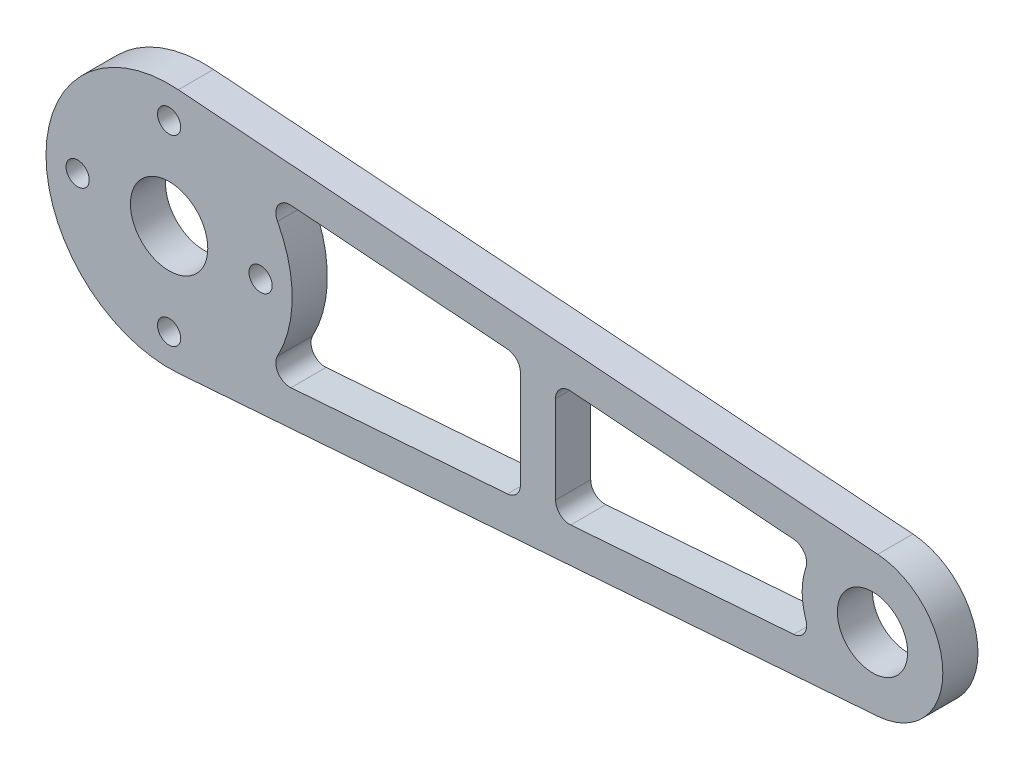
ISO-10303-21;
HEADER;
FILE_DESCRIPTION(('STEP AP214'),'2;1');
FILE_NAME('part.step','',(''),(''),'','','');
FILE_SCHEMA(('AUTOMOTIVE_DESIGN { 1 0 10303 214 1 1 1 1 }'));
ENDSEC;
DATA;
#1=APPLICATION_CONTEXT('core data for automotive mechanical design processes');
#2=APPLICATION_PROTOCOL_DEFINITION('international standard','automotive_design',2000,#1);
#3=PRODUCT_CONTEXT('',#1,'mechanical');
#4=PRODUCT('Part','Part','',(#3));
#5=PRODUCT_RELATED_PRODUCT_CATEGORY('part','',(#4));
#6=PRODUCT_DEFINITION_FORMATION('','',#4);
#7=PRODUCT_DEFINITION_CONTEXT('part definition',#1,'design');
#8=PRODUCT_DEFINITION('design','',#6,#7);
#9=PRODUCT_DEFINITION_SHAPE('','',#8);
#10=(LENGTH_UNIT() NAMED_UNIT(*) SI_UNIT(.MILLI.,.METRE.));
#11=(NAMED_UNIT(*) PLANE_ANGLE_UNIT() SI_UNIT($,.RADIAN.));
#12=(NAMED_UNIT(*) SI_UNIT($,.STERADIAN.) SOLID_ANGLE_UNIT());
#13=UNCERTAINTY_MEASURE_WITH_UNIT(LENGTH_MEASURE(1.E-05),#10,'distance_accuracy_value','');
#14=(GEOMETRIC_REPRESENTATION_CONTEXT(3) GLOBAL_UNCERTAINTY_ASSIGNED_CONTEXT((#13)) GLOBAL_UNIT_ASSIGNED_CONTEXT((#10,
#11,#12)) REPRESENTATION_CONTEXT('',''));
#15=CARTESIAN_POINT('',(0.,0.,0.));
#16=DIRECTION('',(0.,0.,1.));
#17=DIRECTION('',(1.,0.,0.));
#18=AXIS2_PLACEMENT_3D('',#15,#16,#17);
#19=CARTESIAN_POINT('',(0.,0.,5.));
#20=DIRECTION('',(0.,0.,1.));
#21=DIRECTION('',(1.,0.,0.));
#22=AXIS2_PLACEMENT_3D('',#19,#20,#21);
#23=PLANE('',#22);
#24=CARTESIAN_POINT('',(0.,-13.,5.));
#25=DIRECTION('',(0.,0.,1.));
#26=DIRECTION('',(1.,0.,0.));
#27=AXIS2_PLACEMENT_3D('',#24,#25,#26);
#28=CIRCLE('',#27,1.65);
#29=CARTESIAN_POINT('',(1.64999999999991,-13.,5.));
#30=VERTEX_POINT('',#29);
#31=EDGE_CURVE('E240',#30,#30,#28,.T.);
#32=ORIENTED_EDGE('',*,*,#31,.F.);
#33=EDGE_LOOP('',(#32));
#34=FACE_BOUND('',#33,.T.);
#35=CARTESIAN_POINT('',(0.,13.,5.));
#36=DIRECTION('',(0.,0.,1.));
#37=DIRECTION('',(1.,0.,0.));
#38=AXIS2_PLACEMENT_3D('',#35,#36,#37);
#39=CIRCLE('',#38,1.65);
#40=CARTESIAN_POINT('',(1.65,13.,5.));
#41=VERTEX_POINT('',#40);
#42=EDGE_CURVE('E252',#41,#41,#39,.T.);
#43=ORIENTED_EDGE('',*,*,#42,.F.);
#44=EDGE_LOOP('',(#43));
#45=FACE_BOUND('',#44,.T.);
#46=CARTESIAN_POINT('',(0.,0.,5.));
#47=DIRECTION('',(0.,0.,1.));
#48=DIRECTION('',(1.,0.,0.));
#49=AXIS2_PLACEMENT_3D('',#46,#47,#48);
#50=CIRCLE('',#49,5.5);
#51=CARTESIAN_POINT('',(5.5,0.,5.));
#52=VERTEX_POINT('',#51);
#53=EDGE_CURVE('E264',#52,#52,#50,.T.);
#54=ORIENTED_EDGE('',*,*,#53,.F.);
#55=EDGE_LOOP('',(#54));
#56=FACE_BOUND('',#55,.T.);
#57=CARTESIAN_POINT('',(0.,0.,5.));
#58=DIRECTION('',(0.,0.,1.));
#59=DIRECTION('',(1.,0.,0.));
#60=AXIS2_PLACEMENT_3D('',#57,#58,#59);
#61=CIRCLE('',#60,17.5);
#62=CARTESIAN_POINT('',(1.31249999999999,17.4507118407817,5.));
#63=VERTEX_POINT('',#62);
#64=CARTESIAN_POINT('',(1.31250000000001,-17.4507118407817,5.));
#65=VERTEX_POINT('',#64);
#66=EDGE_CURVE('E329',#63,#65,#61,.T.);
#67=ORIENTED_EDGE('',*,*,#66,.T.);
#68=DIRECTION('',(0.997183533758957,0.0750000000000005,0.));
#69=VECTOR('',#68,1.);
#70=CARTESIAN_POINT('',(1.31250000000001,-17.4507118407817,5.));
#71=LINE('',#70,#69);
#72=CARTESIAN_POINT('',(100.75,-9.97183533758952,5.));
#73=VERTEX_POINT('',#72);
#74=EDGE_CURVE('E332',#65,#73,#71,.T.);
#75=ORIENTED_EDGE('',*,*,#74,.T.);
#76=CARTESIAN_POINT('',(100.,0.,5.));
#77=DIRECTION('',(0.,0.,1.));
#78=DIRECTION('',(1.,0.,0.));
#79=AXIS2_PLACEMENT_3D('',#76,#77,#78);
#80=CIRCLE('',#79,10.);
#81=CARTESIAN_POINT('',(100.75,9.97183533758961,5.));
#82=VERTEX_POINT('',#81);
#83=EDGE_CURVE('E335',#73,#82,#80,.T.);
#84=ORIENTED_EDGE('',*,*,#83,.T.);
#85=DIRECTION('',(-0.997183533758957,0.0749999999999997,0.));
#86=VECTOR('',#85,1.);
#87=CARTESIAN_POINT('',(1.31249999999999,17.4507118407817,5.));
#88=LINE('',#87,#86);
#89=EDGE_CURVE('E337',#82,#63,#88,.T.);
#90=ORIENTED_EDGE('',*,*,#89,.T.);
#91=EDGE_LOOP('',(#67,#75,#84,#90));
#92=FACE_BOUND('',#91,.T.);
#93=CARTESIAN_POINT('',(100.,0.,5.));
#94=DIRECTION('',(0.,0.,-1.));
#95=DIRECTION('',(1.,0.,0.));
#96=AXIS2_PLACEMENT_3D('',#93,#94,#95);
#97=CIRCLE('',#96,9.99999999999999);
#98=CARTESIAN_POINT('',(90.5323119515982,-3.21914321181123,5.));
#99=VERTEX_POINT('',#98);
#100=CARTESIAN_POINT('',(90.5323119515982,3.21914321181132,5.));
#101=VERTEX_POINT('',#100);
#102=EDGE_CURVE('E272',#99,#101,#97,.T.);
#103=ORIENTED_EDGE('',*,*,#102,.F.);
#104=CARTESIAN_POINT('',(88.6387743419179,-3.86297185417349,5.));
#105=DIRECTION('',(0.,0.,1.));
#106=DIRECTION('',(-1.,0.,0.));
#107=AXIS2_PLACEMENT_3D('',#104,#105,#106);
#108=CIRCLE('',#107,2.);
#109=CARTESIAN_POINT('',(88.7887743419179,-5.8573389216914,5.));
#110=VERTEX_POINT('',#109);
#111=EDGE_CURVE('E270',#110,#99,#108,.T.);
#112=ORIENTED_EDGE('',*,*,#111,.F.);
#113=DIRECTION('',(0.997183533758956,0.0750000000000008,0.));
#114=VECTOR('',#113,1.);
#115=CARTESIAN_POINT('',(57.0947957316832,-8.24110110316984,5.));
#116=LINE('',#115,#114);
#117=CARTESIAN_POINT('',(57.0947957316832,-8.24110110316984,5.));
#118=VERTEX_POINT('',#117);
#119=EDGE_CURVE('E286',#118,#110,#116,.T.);
#120=ORIENTED_EDGE('',*,*,#119,.F.);
#121=CARTESIAN_POINT('',(56.9447957316832,-6.24673403565193,5.));
#122=DIRECTION('',(0.,0.,1.));
#123=DIRECTION('',(-1.,0.,0.));
#124=AXIS2_PLACEMENT_3D('',#121,#122,#123);
#125=CIRCLE('',#124,2.);
#126=CARTESIAN_POINT('',(54.9447957316832,-6.24673403565192,5.));
#127=VERTEX_POINT('',#126);
#128=EDGE_CURVE('E283',#127,#118,#125,.T.);
#129=ORIENTED_EDGE('',*,*,#128,.F.);
#130=DIRECTION('',(0.,-1.,0.));
#131=VECTOR('',#130,1.);
#132=CARTESIAN_POINT('',(54.9447957316832,6.24673403565196,5.));
#133=LINE('',#132,#131);
#134=CARTESIAN_POINT('',(54.9447957316832,6.24673403565196,5.));
#135=VERTEX_POINT('',#134);
#136=EDGE_CURVE('E281',#135,#127,#133,.T.);
#137=ORIENTED_EDGE('',*,*,#136,.F.);
#138=CARTESIAN_POINT('',(56.9447957316832,6.24673403565198,5.));
#139=DIRECTION('',(0.,0.,1.));
#140=DIRECTION('',(-1.,0.,0.));
#141=AXIS2_PLACEMENT_3D('',#138,#139,#140);
#142=CIRCLE('',#141,2.);
#143=CARTESIAN_POINT('',(57.0947957316832,8.24110110316989,5.));
#144=VERTEX_POINT('',#143);
#145=EDGE_CURVE('E279',#144,#135,#142,.T.);
#146=ORIENTED_EDGE('',*,*,#145,.F.);
#147=DIRECTION('',(-0.997183533758956,0.0749999999999995,0.));
#148=VECTOR('',#147,1.);
#149=CARTESIAN_POINT('',(57.0947957316832,8.24110110316989,5.));
#150=LINE('',#149,#148);
#151=CARTESIAN_POINT('',(88.7887743419179,5.85733892169149,5.));
#152=VERTEX_POINT('',#151);
#153=EDGE_CURVE('E277',#152,#144,#150,.T.);
#154=ORIENTED_EDGE('',*,*,#153,.F.);
#155=CARTESIAN_POINT('',(88.6387743419179,3.86297185417358,5.));
#156=DIRECTION('',(0.,0.,1.));
#157=DIRECTION('',(1.,0.,0.));
#158=AXIS2_PLACEMENT_3D('',#155,#156,#157);
#159=CIRCLE('',#158,2.);
#160=EDGE_CURVE('E275',#101,#152,#159,.T.);
#161=ORIENTED_EDGE('',*,*,#160,.F.);
#162=EDGE_LOOP('',(#103,#112,#120,#129,#137,#146,#154,#161));
#163=FACE_BOUND('',#162,.T.);
#164=CARTESIAN_POINT('',(100.,0.,5.));
#165=DIRECTION('',(0.,0.,1.));
#166=DIRECTION('',(1.,0.,0.));
#167=AXIS2_PLACEMENT_3D('',#164,#165,#166);
#168=CIRCLE('',#167,5.);
#169=CARTESIAN_POINT('',(105.,0.,5.));
#170=VERTEX_POINT('',#169);
#171=EDGE_CURVE('E258',#170,#170,#168,.T.);
#172=ORIENTED_EDGE('',*,*,#171,.F.);
#173=EDGE_LOOP('',(#172));
#174=FACE_BOUND('',#173,.T.);
#175=CARTESIAN_POINT('',(13.,0.,5.));
#176=DIRECTION('',(0.,0.,1.));
#177=DIRECTION('',(1.,0.,0.));
#178=AXIS2_PLACEMENT_3D('',#175,#176,#177);
#179=CIRCLE('',#178,1.65);
#180=CARTESIAN_POINT('',(14.65,0.,5.));
#181=VERTEX_POINT('',#180);
#182=EDGE_CURVE('E246',#181,#181,#179,.T.);
#183=ORIENTED_EDGE('',*,*,#182,.F.);
#184=EDGE_LOOP('',(#183));
#185=FACE_BOUND('',#184,.T.);
#186=CARTESIAN_POINT('',(-13.,1.36167772214882E-13,5.));
#187=DIRECTION('',(0.,0.,1.));
#188=DIRECTION('',(1.,0.,0.));
#189=AXIS2_PLACEMENT_3D('',#186,#187,#188);
#190=CIRCLE('',#189,1.65);
#191=CARTESIAN_POINT('',(-11.35,1.36167772214882E-13,5.));
#192=VERTEX_POINT('',#191);
#193=EDGE_CURVE('E234',#192,#192,#190,.T.);
#194=ORIENTED_EDGE('',*,*,#193,.F.);
#195=EDGE_LOOP('',(#194));
#196=FACE_BOUND('',#195,.T.);
#197=DIRECTION('',(0.,1.,0.));
#198=VECTOR('',#197,1.);
#199=CARTESIAN_POINT('',(49.9447957316831,6.92364051991322,5.));
#200=LINE('',#199,#198);
#201=CARTESIAN_POINT('',(49.9447957316831,-6.92364051991319,5.));
#202=VERTEX_POINT('',#201);
#203=CARTESIAN_POINT('',(49.9447957316831,6.92364051991322,5.));
#204=VERTEX_POINT('',#203);
#205=EDGE_CURVE('E177',#202,#204,#200,.T.);
#206=ORIENTED_EDGE('',*,*,#205,.F.);
#207=CARTESIAN_POINT('',(47.9447957316831,-6.9236405199132,5.));
#208=DIRECTION('',(0.,0.,1.));
#209=DIRECTION('',(-1.,0.,0.));
#210=AXIS2_PLACEMENT_3D('',#207,#208,#209);
#211=CIRCLE('',#210,2.);
#212=CARTESIAN_POINT('',(48.0947957316831,-8.91800758743112,5.));
#213=VERTEX_POINT('',#212);
#214=EDGE_CURVE('E169',#213,#202,#211,.T.);
#215=ORIENTED_EDGE('',*,*,#214,.F.);
#216=DIRECTION('',(0.997183533758957,0.0750000000000004,0.));
#217=VECTOR('',#216,1.);
#218=CARTESIAN_POINT('',(17.3228974623749,-11.2324184176003,5.));
#219=LINE('',#218,#217);
#220=CARTESIAN_POINT('',(17.3228974623749,-11.2324184176003,5.));
#221=VERTEX_POINT('',#220);
#222=EDGE_CURVE('E202',#221,#213,#219,.T.);
#223=ORIENTED_EDGE('',*,*,#222,.F.);
#224=CARTESIAN_POINT('',(17.1728974623749,-9.23805135008241,5.));
#225=DIRECTION('',(0.,0.,1.));
#226=DIRECTION('',(1.,0.,0.));
#227=AXIS2_PLACEMENT_3D('',#224,#225,#226);
#228=CIRCLE('',#227,2.);
#229=CARTESIAN_POINT('',(15.411574645721,-8.29055890392011,5.));
#230=VERTEX_POINT('',#229);
#231=EDGE_CURVE('E200',#230,#221,#228,.T.);
#232=ORIENTED_EDGE('',*,*,#231,.F.);
#233=CARTESIAN_POINT('',(0.,0.,5.));
#234=DIRECTION('',(0.,0.,-1.));
#235=DIRECTION('',(1.,0.,0.));
#236=AXIS2_PLACEMENT_3D('',#233,#234,#235);
#237=CIRCLE('',#236,17.5);
#238=CARTESIAN_POINT('',(15.411574645721,8.29055890392012,5.));
#239=VERTEX_POINT('',#238);
#240=EDGE_CURVE('E198',#239,#230,#237,.T.);
#241=ORIENTED_EDGE('',*,*,#240,.F.);
#242=CARTESIAN_POINT('',(17.1728974623749,9.23805135008242,5.));
#243=DIRECTION('',(0.,0.,1.));
#244=DIRECTION('',(-1.,0.,0.));
#245=AXIS2_PLACEMENT_3D('',#242,#243,#244);
#246=CIRCLE('',#245,2.);
#247=CARTESIAN_POINT('',(17.3228974623749,11.2324184176003,5.));
#248=VERTEX_POINT('',#247);
#249=EDGE_CURVE('E196',#248,#239,#246,.T.);
#250=ORIENTED_EDGE('',*,*,#249,.F.);
#251=DIRECTION('',(-0.997183533758957,0.0749999999999994,0.));
#252=VECTOR('',#251,1.);
#253=CARTESIAN_POINT('',(17.3228974623749,11.2324184176003,5.));
#254=LINE('',#253,#252);
#255=CARTESIAN_POINT('',(48.0947957316831,8.91800758743115,5.));
#256=VERTEX_POINT('',#255);
#257=EDGE_CURVE('E192',#256,#248,#254,.T.);
#258=ORIENTED_EDGE('',*,*,#257,.F.);
#259=CARTESIAN_POINT('',(47.9447957316831,6.92364051991324,5.));
#260=DIRECTION('',(0.,0.,1.));
#261=DIRECTION('',(-1.,0.,0.));
#262=AXIS2_PLACEMENT_3D('',#259,#260,#261);
#263=CIRCLE('',#262,2.);
#264=EDGE_CURVE('E190',#204,#256,#263,.T.);
#265=ORIENTED_EDGE('',*,*,#264,.F.);
#266=EDGE_LOOP('',(#206,#215,#223,#232,#241,#250,#258,#265));
#267=FACE_BOUND('',#266,.T.);
#268=ADVANCED_FACE('F32',(#34,#45,#56,#92,#163,#174,#185,#196,#267),#23,.T.);
#269=CARTESIAN_POINT('',(0.,0.,0.));
#270=DIRECTION('',(0.,0.,1.));
#271=DIRECTION('',(1.,0.,0.));
#272=AXIS2_PLACEMENT_3D('',#269,#270,#271);
#273=PLANE('',#272);
#274=CARTESIAN_POINT('',(-13.,1.36167772214882E-13,0.));
#275=DIRECTION('',(0.,0.,1.));
#276=DIRECTION('',(1.,0.,0.));
#277=AXIS2_PLACEMENT_3D('',#274,#275,#276);
#278=CIRCLE('',#277,1.65);
#279=CARTESIAN_POINT('',(-11.35,1.36167772214882E-13,0.));
#280=VERTEX_POINT('',#279);
#281=EDGE_CURVE('E185',#280,#280,#278,.T.);
#282=ORIENTED_EDGE('',*,*,#281,.T.);
#283=EDGE_LOOP('',(#282));
#284=FACE_BOUND('',#283,.T.);
#285=CARTESIAN_POINT('',(0.,-13.,0.));
#286=DIRECTION('',(0.,0.,1.));
#287=DIRECTION('',(1.,0.,0.));
#288=AXIS2_PLACEMENT_3D('',#285,#286,#287);
#289=CIRCLE('',#288,1.65);
#290=CARTESIAN_POINT('',(1.64999999999991,-13.,0.));
#291=VERTEX_POINT('',#290);
#292=EDGE_CURVE('E237',#291,#291,#289,.T.);
#293=ORIENTED_EDGE('',*,*,#292,.T.);
#294=EDGE_LOOP('',(#293));
#295=FACE_BOUND('',#294,.T.);
#296=CARTESIAN_POINT('',(13.,0.,0.));
#297=DIRECTION('',(0.,0.,1.));
#298=DIRECTION('',(1.,0.,0.));
#299=AXIS2_PLACEMENT_3D('',#296,#297,#298);
#300=CIRCLE('',#299,1.65);
#301=CARTESIAN_POINT('',(14.65,0.,0.));
#302=VERTEX_POINT('',#301);
#303=EDGE_CURVE('E243',#302,#302,#300,.T.);
#304=ORIENTED_EDGE('',*,*,#303,.T.);
#305=EDGE_LOOP('',(#304));
#306=FACE_BOUND('',#305,.T.);
#307=CARTESIAN_POINT('',(0.,13.,0.));
#308=DIRECTION('',(0.,0.,1.));
#309=DIRECTION('',(1.,0.,0.));
#310=AXIS2_PLACEMENT_3D('',#307,#308,#309);
#311=CIRCLE('',#310,1.65);
#312=CARTESIAN_POINT('',(1.65,13.,0.));
#313=VERTEX_POINT('',#312);
#314=EDGE_CURVE('E249',#313,#313,#311,.T.);
#315=ORIENTED_EDGE('',*,*,#314,.T.);
#316=EDGE_LOOP('',(#315));
#317=FACE_BOUND('',#316,.T.);
#318=CARTESIAN_POINT('',(100.,0.,0.));
#319=DIRECTION('',(0.,0.,1.));
#320=DIRECTION('',(1.,0.,0.));
#321=AXIS2_PLACEMENT_3D('',#318,#319,#320);
#322=CIRCLE('',#321,5.);
#323=CARTESIAN_POINT('',(105.,0.,0.));
#324=VERTEX_POINT('',#323);
#325=EDGE_CURVE('E255',#324,#324,#322,.T.);
#326=ORIENTED_EDGE('',*,*,#325,.T.);
#327=EDGE_LOOP('',(#326));
#328=FACE_BOUND('',#327,.T.);
#329=CARTESIAN_POINT('',(0.,0.,0.));
#330=DIRECTION('',(0.,0.,1.));
#331=DIRECTION('',(1.,0.,0.));
#332=AXIS2_PLACEMENT_3D('',#329,#330,#331);
#333=CIRCLE('',#332,5.5);
#334=CARTESIAN_POINT('',(5.5,0.,0.));
#335=VERTEX_POINT('',#334);
#336=EDGE_CURVE('E261',#335,#335,#333,.T.);
#337=ORIENTED_EDGE('',*,*,#336,.T.);
#338=EDGE_LOOP('',(#337));
#339=FACE_BOUND('',#338,.T.);
#340=CARTESIAN_POINT('',(88.6387743419179,-3.86297185417349,0.));
#341=DIRECTION('',(0.,0.,1.));
#342=DIRECTION('',(-1.,0.,0.));
#343=AXIS2_PLACEMENT_3D('',#340,#341,#342);
#344=CIRCLE('',#343,2.);
#345=CARTESIAN_POINT('',(88.7887743419179,-5.8573389216914,0.));
#346=VERTEX_POINT('',#345);
#347=CARTESIAN_POINT('',(90.5323119515982,-3.21914321181123,0.));
#348=VERTEX_POINT('',#347);
#349=EDGE_CURVE('E267',#346,#348,#344,.T.);
#350=ORIENTED_EDGE('',*,*,#349,.T.);
#351=CARTESIAN_POINT('',(100.,0.,0.));
#352=DIRECTION('',(0.,0.,-1.));
#353=DIRECTION('',(1.,0.,0.));
#354=AXIS2_PLACEMENT_3D('',#351,#352,#353);
#355=CIRCLE('',#354,9.99999999999999);
#356=CARTESIAN_POINT('',(90.5323119515982,3.21914321181132,0.));
#357=VERTEX_POINT('',#356);
#358=EDGE_CURVE('E291',#348,#357,#355,.T.);
#359=ORIENTED_EDGE('',*,*,#358,.T.);
#360=CARTESIAN_POINT('',(88.6387743419179,3.86297185417358,0.));
#361=DIRECTION('',(0.,0.,1.));
#362=DIRECTION('',(1.,0.,0.));
#363=AXIS2_PLACEMENT_3D('',#360,#361,#362);
#364=CIRCLE('',#363,2.);
#365=CARTESIAN_POINT('',(88.7887743419179,5.85733892169149,0.));
#366=VERTEX_POINT('',#365);
#367=EDGE_CURVE('E294',#357,#366,#364,.T.);
#368=ORIENTED_EDGE('',*,*,#367,.T.);
#369=DIRECTION('',(-0.997183533758956,0.0749999999999995,0.));
#370=VECTOR('',#369,1.);
#371=CARTESIAN_POINT('',(57.0947957316832,8.24110110316989,0.));
#372=LINE('',#371,#370);
#373=CARTESIAN_POINT('',(57.0947957316832,8.24110110316989,0.));
#374=VERTEX_POINT('',#373);
#375=EDGE_CURVE('E297',#366,#374,#372,.T.);
#376=ORIENTED_EDGE('',*,*,#375,.T.);
#377=CARTESIAN_POINT('',(56.9447957316832,6.24673403565198,0.));
#378=DIRECTION('',(0.,0.,1.));
#379=DIRECTION('',(-1.,0.,0.));
#380=AXIS2_PLACEMENT_3D('',#377,#378,#379);
#381=CIRCLE('',#380,2.);
#382=CARTESIAN_POINT('',(54.9447957316832,6.24673403565196,0.));
#383=VERTEX_POINT('',#382);
#384=EDGE_CURVE('E300',#374,#383,#381,.T.);
#385=ORIENTED_EDGE('',*,*,#384,.T.);
#386=DIRECTION('',(0.,-1.,0.));
#387=VECTOR('',#386,1.);
#388=CARTESIAN_POINT('',(54.9447957316832,6.24673403565196,0.));
#389=LINE('',#388,#387);
#390=CARTESIAN_POINT('',(54.9447957316832,-6.24673403565192,0.));
#391=VERTEX_POINT('',#390);
#392=EDGE_CURVE('E303',#383,#391,#389,.T.);
#393=ORIENTED_EDGE('',*,*,#392,.T.);
#394=CARTESIAN_POINT('',(56.9447957316832,-6.24673403565193,0.));
#395=DIRECTION('',(0.,0.,1.));
#396=DIRECTION('',(-1.,0.,0.));
#397=AXIS2_PLACEMENT_3D('',#394,#395,#396);
#398=CIRCLE('',#397,2.);
#399=CARTESIAN_POINT('',(57.0947957316832,-8.24110110316984,0.));
#400=VERTEX_POINT('',#399);
#401=EDGE_CURVE('E306',#391,#400,#398,.T.);
#402=ORIENTED_EDGE('',*,*,#401,.T.);
#403=DIRECTION('',(0.997183533758956,0.0750000000000008,0.));
#404=VECTOR('',#403,1.);
#405=CARTESIAN_POINT('',(57.0947957316832,-8.24110110316984,0.));
#406=LINE('',#405,#404);
#407=EDGE_CURVE('E273',#400,#346,#406,.T.);
#408=ORIENTED_EDGE('',*,*,#407,.T.);
#409=EDGE_LOOP('',(#350,#359,#368,#376,#385,#393,#402,#408));
#410=FACE_BOUND('',#409,.T.);
#411=CARTESIAN_POINT('',(0.,0.,0.));
#412=DIRECTION('',(0.,0.,1.));
#413=DIRECTION('',(1.,0.,0.));
#414=AXIS2_PLACEMENT_3D('',#411,#412,#413);
#415=CIRCLE('',#414,17.5);
#416=CARTESIAN_POINT('',(1.31249999999999,17.4507118407817,0.));
#417=VERTEX_POINT('',#416);
#418=CARTESIAN_POINT('',(1.31250000000001,-17.4507118407817,0.));
#419=VERTEX_POINT('',#418);
#420=EDGE_CURVE('E328',#417,#419,#415,.T.);
#421=ORIENTED_EDGE('',*,*,#420,.F.);
#422=DIRECTION('',(-0.997183533758957,0.0749999999999997,0.));
#423=VECTOR('',#422,1.);
#424=CARTESIAN_POINT('',(1.31249999999999,17.4507118407817,0.));
#425=LINE('',#424,#423);
#426=CARTESIAN_POINT('',(100.75,9.97183533758961,0.));
#427=VERTEX_POINT('',#426);
#428=EDGE_CURVE('E333',#427,#417,#425,.T.);
#429=ORIENTED_EDGE('',*,*,#428,.F.);
#430=CARTESIAN_POINT('',(100.,0.,0.));
#431=DIRECTION('',(0.,0.,1.));
#432=DIRECTION('',(1.,0.,0.));
#433=AXIS2_PLACEMENT_3D('',#430,#431,#432);
#434=CIRCLE('',#433,10.);
#435=CARTESIAN_POINT('',(100.75,-9.97183533758952,0.));
#436=VERTEX_POINT('',#435);
#437=EDGE_CURVE('E344',#436,#427,#434,.T.);
#438=ORIENTED_EDGE('',*,*,#437,.F.);
#439=DIRECTION('',(0.997183533758957,0.0750000000000005,0.));
#440=VECTOR('',#439,1.);
#441=CARTESIAN_POINT('',(1.31250000000001,-17.4507118407817,0.));
#442=LINE('',#441,#440);
#443=EDGE_CURVE('E342',#419,#436,#442,.T.);
#444=ORIENTED_EDGE('',*,*,#443,.F.);
#445=EDGE_LOOP('',(#421,#429,#438,#444));
#446=FACE_BOUND('',#445,.T.);
#447=CARTESIAN_POINT('',(47.9447957316831,-6.9236405199132,0.));
#448=DIRECTION('',(0.,0.,1.));
#449=DIRECTION('',(-1.,0.,0.));
#450=AXIS2_PLACEMENT_3D('',#447,#448,#449);
#451=CIRCLE('',#450,2.);
#452=CARTESIAN_POINT('',(48.0947957316831,-8.91800758743112,0.));
#453=VERTEX_POINT('',#452);
#454=CARTESIAN_POINT('',(49.9447957316831,-6.92364051991319,0.));
#455=VERTEX_POINT('',#454);
#456=EDGE_CURVE('E55',#453,#455,#451,.T.);
#457=ORIENTED_EDGE('',*,*,#456,.T.);
#458=DIRECTION('',(0.,1.,0.));
#459=VECTOR('',#458,1.);
#460=CARTESIAN_POINT('',(49.9447957316831,6.92364051991322,0.));
#461=LINE('',#460,#459);
#462=CARTESIAN_POINT('',(49.9447957316831,6.92364051991322,0.));
#463=VERTEX_POINT('',#462);
#464=EDGE_CURVE('E184',#455,#463,#461,.T.);
#465=ORIENTED_EDGE('',*,*,#464,.T.);
#466=CARTESIAN_POINT('',(47.9447957316831,6.92364051991324,0.));
#467=DIRECTION('',(0.,0.,1.));
#468=DIRECTION('',(-1.,0.,0.));
#469=AXIS2_PLACEMENT_3D('',#466,#467,#468);
#470=CIRCLE('',#469,2.);
#471=CARTESIAN_POINT('',(48.0947957316831,8.91800758743115,0.));
#472=VERTEX_POINT('',#471);
#473=EDGE_CURVE('E206',#463,#472,#470,.T.);
#474=ORIENTED_EDGE('',*,*,#473,.T.);
#475=DIRECTION('',(-0.997183533758957,0.0749999999999994,0.));
#476=VECTOR('',#475,1.);
#477=CARTESIAN_POINT('',(17.3228974623749,11.2324184176003,0.));
#478=LINE('',#477,#476);
#479=CARTESIAN_POINT('',(17.3228974623749,11.2324184176003,0.));
#480=VERTEX_POINT('',#479);
#481=EDGE_CURVE('E209',#472,#480,#478,.T.);
#482=ORIENTED_EDGE('',*,*,#481,.T.);
#483=CARTESIAN_POINT('',(17.1728974623749,9.23805135008242,0.));
#484=DIRECTION('',(0.,0.,1.));
#485=DIRECTION('',(-1.,0.,0.));
#486=AXIS2_PLACEMENT_3D('',#483,#484,#485);
#487=CIRCLE('',#486,2.);
#488=CARTESIAN_POINT('',(15.411574645721,8.29055890392012,0.));
#489=VERTEX_POINT('',#488);
#490=EDGE_CURVE('E212',#480,#489,#487,.T.);
#491=ORIENTED_EDGE('',*,*,#490,.T.);
#492=CARTESIAN_POINT('',(0.,0.,0.));
#493=DIRECTION('',(0.,0.,-1.));
#494=DIRECTION('',(1.,0.,0.));
#495=AXIS2_PLACEMENT_3D('',#492,#493,#494);
#496=CIRCLE('',#495,17.5);
#497=CARTESIAN_POINT('',(15.411574645721,-8.29055890392011,0.));
#498=VERTEX_POINT('',#497);
#499=EDGE_CURVE('E215',#489,#498,#496,.T.);
#500=ORIENTED_EDGE('',*,*,#499,.T.);
#501=CARTESIAN_POINT('',(17.1728974623749,-9.23805135008241,0.));
#502=DIRECTION('',(0.,0.,1.));
#503=DIRECTION('',(1.,0.,0.));
#504=AXIS2_PLACEMENT_3D('',#501,#502,#503);
#505=CIRCLE('',#504,2.);
#506=CARTESIAN_POINT('',(17.3228974623749,-11.2324184176003,0.));
#507=VERTEX_POINT('',#506);
#508=EDGE_CURVE('E218',#498,#507,#505,.T.);
#509=ORIENTED_EDGE('',*,*,#508,.T.);
#510=DIRECTION('',(0.997183533758957,0.0750000000000004,0.));
#511=VECTOR('',#510,1.);
#512=CARTESIAN_POINT('',(17.3228974623749,-11.2324184176003,0.));
#513=LINE('',#512,#511);
#514=EDGE_CURVE('E178',#507,#453,#513,.T.);
#515=ORIENTED_EDGE('',*,*,#514,.T.);
#516=EDGE_LOOP('',(#457,#465,#474,#482,#491,#500,#509,#515));
#517=FACE_BOUND('',#516,.T.);
#518=ADVANCED_FACE('F362',(#284,#295,#306,#317,#328,#339,#410,#446,#517),#273,.F.);
#519=CARTESIAN_POINT('',(0.,0.,5.));
#520=DIRECTION('',(0.,0.,-1.));
#521=DIRECTION('',(-1.,0.,0.));
#522=AXIS2_PLACEMENT_3D('',#519,#520,#521);
#523=CYLINDRICAL_SURFACE('',#522,17.5);
#524=ORIENTED_EDGE('',*,*,#420,.T.);
#525=DIRECTION('',(0.,0.,-1.));
#526=VECTOR('',#525,1.);
#527=CARTESIAN_POINT('',(1.31250000000001,-17.4507118407817,5.));
#528=LINE('',#527,#526);
#529=EDGE_CURVE('E11',#65,#419,#528,.T.);
#530=ORIENTED_EDGE('',*,*,#529,.F.);
#531=ORIENTED_EDGE('',*,*,#66,.F.);
#532=DIRECTION('',(0.,0.,-1.));
#533=VECTOR('',#532,1.);
#534=CARTESIAN_POINT('',(1.31249999999999,17.4507118407817,5.));
#535=LINE('',#534,#533);
#536=EDGE_CURVE('E339',#63,#417,#535,.T.);
#537=ORIENTED_EDGE('',*,*,#536,.T.);
#538=EDGE_LOOP('',(#524,#530,#531,#537));
#539=FACE_BOUND('',#538,.T.);
#540=ADVANCED_FACE('F34',(#539),#523,.T.);
#541=CARTESIAN_POINT('',(1.31250000000001,-17.4507118407817,5.));
#542=DIRECTION('',(-0.0750000000000005,0.997183533758957,0.));
#543=DIRECTION('',(-0.997183533758957,-0.0750000000000005,0.));
#544=AXIS2_PLACEMENT_3D('',#541,#542,#543);
#545=PLANE('',#544);
#546=ORIENTED_EDGE('',*,*,#443,.T.);
#547=DIRECTION('',(0.,0.,-1.));
#548=VECTOR('',#547,1.);
#549=CARTESIAN_POINT('',(100.75,-9.97183533758952,5.));
#550=LINE('',#549,#548);
#551=EDGE_CURVE('E40',#73,#436,#550,.T.);
#552=ORIENTED_EDGE('',*,*,#551,.F.);
#553=ORIENTED_EDGE('',*,*,#74,.F.);
#554=ORIENTED_EDGE('',*,*,#529,.T.);
#555=EDGE_LOOP('',(#546,#552,#553,#554));
#556=FACE_BOUND('',#555,.T.);
#557=ADVANCED_FACE('F373',(#556),#545,.F.);
#558=CARTESIAN_POINT('',(100.,0.,5.));
#559=DIRECTION('',(0.,0.,-1.));
#560=DIRECTION('',(-1.,0.,0.));
#561=AXIS2_PLACEMENT_3D('',#558,#559,#560);
#562=CYLINDRICAL_SURFACE('',#561,10.);
#563=ORIENTED_EDGE('',*,*,#437,.T.);
#564=DIRECTION('',(0.,0.,-1.));
#565=VECTOR('',#564,1.);
#566=CARTESIAN_POINT('',(100.75,9.97183533758961,5.));
#567=LINE('',#566,#565);
#568=EDGE_CURVE('E349',#82,#427,#567,.T.);
#569=ORIENTED_EDGE('',*,*,#568,.F.);
#570=ORIENTED_EDGE('',*,*,#83,.F.);
#571=ORIENTED_EDGE('',*,*,#551,.T.);
#572=EDGE_LOOP('',(#563,#569,#570,#571));
#573=FACE_BOUND('',#572,.T.);
#574=ADVANCED_FACE('F356',(#573),#562,.T.);
#575=CARTESIAN_POINT('',(1.31249999999999,17.4507118407817,5.));
#576=DIRECTION('',(-0.0749999999999997,-0.997183533758957,0.));
#577=DIRECTION('',(0.997183533758957,-0.0749999999999997,0.));
#578=AXIS2_PLACEMENT_3D('',#575,#576,#577);
#579=PLANE('',#578);
#580=ORIENTED_EDGE('',*,*,#428,.T.);
#581=ORIENTED_EDGE('',*,*,#536,.F.);
#582=ORIENTED_EDGE('',*,*,#89,.F.);
#583=ORIENTED_EDGE('',*,*,#568,.T.);
#584=EDGE_LOOP('',(#580,#581,#582,#583));
#585=FACE_BOUND('',#584,.T.);
#586=ADVANCED_FACE('F366',(#585),#579,.F.);
#587=CARTESIAN_POINT('',(88.6387743419179,-3.86297185417349,5.));
#588=DIRECTION('',(0.,0.,-1.));
#589=DIRECTION('',(-1.,0.,0.));
#590=AXIS2_PLACEMENT_3D('',#587,#588,#589);
#591=CYLINDRICAL_SURFACE('',#590,2.);
#592=ORIENTED_EDGE('',*,*,#349,.F.);
#593=DIRECTION('',(0.,0.,-1.));
#594=VECTOR('',#593,1.);
#595=CARTESIAN_POINT('',(88.7887743419179,-5.8573389216914,5.));
#596=LINE('',#595,#594);
#597=EDGE_CURVE('E288',#110,#346,#596,.T.);
#598=ORIENTED_EDGE('',*,*,#597,.F.);
#599=ORIENTED_EDGE('',*,*,#111,.T.);
#600=DIRECTION('',(0.,0.,-1.));
#601=VECTOR('',#600,1.);
#602=CARTESIAN_POINT('',(90.5323119515982,-3.21914321181123,5.));
#603=LINE('',#602,#601);
#604=EDGE_CURVE('E325',#99,#348,#603,.T.);
#605=ORIENTED_EDGE('',*,*,#604,.T.);
#606=EDGE_LOOP('',(#592,#598,#599,#605));
#607=FACE_BOUND('',#606,.T.);
#608=ADVANCED_FACE('F391',(#607),#591,.F.);
#609=CARTESIAN_POINT('',(100.,0.,5.));
#610=DIRECTION('',(0.,0.,-1.));
#611=DIRECTION('',(-1.,0.,0.));
#612=AXIS2_PLACEMENT_3D('',#609,#610,#611);
#613=CYLINDRICAL_SURFACE('',#612,9.99999999999999);
#614=ORIENTED_EDGE('',*,*,#358,.F.);
#615=ORIENTED_EDGE('',*,*,#604,.F.);
#616=ORIENTED_EDGE('',*,*,#102,.T.);
#617=DIRECTION('',(0.,0.,-1.));
#618=VECTOR('',#617,1.);
#619=CARTESIAN_POINT('',(90.5323119515982,3.21914321181132,5.));
#620=LINE('',#619,#618);
#621=EDGE_CURVE('E323',#101,#357,#620,.T.);
#622=ORIENTED_EDGE('',*,*,#621,.T.);
#623=EDGE_LOOP('',(#614,#615,#616,#622));
#624=FACE_BOUND('',#623,.T.);
#625=ADVANCED_FACE('F398',(#624),#613,.T.);
#626=CARTESIAN_POINT('',(88.6387743419179,3.86297185417358,5.));
#627=DIRECTION('',(0.,0.,-1.));
#628=DIRECTION('',(-1.,0.,0.));
#629=AXIS2_PLACEMENT_3D('',#626,#627,#628);
#630=CYLINDRICAL_SURFACE('',#629,2.);
#631=ORIENTED_EDGE('',*,*,#367,.F.);
#632=ORIENTED_EDGE('',*,*,#621,.F.);
#633=ORIENTED_EDGE('',*,*,#160,.T.);
#634=DIRECTION('',(0.,0.,-1.));
#635=VECTOR('',#634,1.);
#636=CARTESIAN_POINT('',(88.7887743419179,5.85733892169149,5.));
#637=LINE('',#636,#635);
#638=EDGE_CURVE('E321',#152,#366,#637,.T.);
#639=ORIENTED_EDGE('',*,*,#638,.T.);
#640=EDGE_LOOP('',(#631,#632,#633,#639));
#641=FACE_BOUND('',#640,.T.);
#642=ADVANCED_FACE('F403',(#641),#630,.F.);
#643=CARTESIAN_POINT('',(57.0947957316832,8.24110110316989,5.));
#644=DIRECTION('',(-0.0749999999999995,-0.997183533758957,0.));
#645=DIRECTION('',(0.997183533758957,-0.0749999999999995,0.));
#646=AXIS2_PLACEMENT_3D('',#643,#644,#645);
#647=PLANE('',#646);
#648=ORIENTED_EDGE('',*,*,#375,.F.);
#649=ORIENTED_EDGE('',*,*,#638,.F.);
#650=ORIENTED_EDGE('',*,*,#153,.T.);
#651=DIRECTION('',(0.,0.,-1.));
#652=VECTOR('',#651,1.);
#653=CARTESIAN_POINT('',(57.0947957316832,8.24110110316989,5.));
#654=LINE('',#653,#652);
#655=EDGE_CURVE('E319',#144,#374,#654,.T.);
#656=ORIENTED_EDGE('',*,*,#655,.T.);
#657=EDGE_LOOP('',(#648,#649,#650,#656));
#658=FACE_BOUND('',#657,.T.);
#659=ADVANCED_FACE('F430',(#658),#647,.T.);
#660=CARTESIAN_POINT('',(56.9447957316832,6.24673403565198,5.));
#661=DIRECTION('',(0.,0.,-1.));
#662=DIRECTION('',(-1.,0.,0.));
#663=AXIS2_PLACEMENT_3D('',#660,#661,#662);
#664=CYLINDRICAL_SURFACE('',#663,2.);
#665=ORIENTED_EDGE('',*,*,#384,.F.);
#666=ORIENTED_EDGE('',*,*,#655,.F.);
#667=ORIENTED_EDGE('',*,*,#145,.T.);
#668=DIRECTION('',(0.,0.,-1.));
#669=VECTOR('',#668,1.);
#670=CARTESIAN_POINT('',(54.9447957316832,6.24673403565196,5.));
#671=LINE('',#670,#669);
#672=EDGE_CURVE('E317',#135,#383,#671,.T.);
#673=ORIENTED_EDGE('',*,*,#672,.T.);
#674=EDGE_LOOP('',(#665,#666,#667,#673));
#675=FACE_BOUND('',#674,.T.);
#676=ADVANCED_FACE('F435',(#675),#664,.F.);
#677=CARTESIAN_POINT('',(54.9447957316832,6.24673403565196,5.));
#678=DIRECTION('',(1.,0.,0.));
#679=DIRECTION('',(0.,0.,-1.));
#680=AXIS2_PLACEMENT_3D('',#677,#678,#679);
#681=PLANE('',#680);
#682=ORIENTED_EDGE('',*,*,#392,.F.);
#683=ORIENTED_EDGE('',*,*,#672,.F.);
#684=ORIENTED_EDGE('',*,*,#136,.T.);
#685=DIRECTION('',(0.,0.,-1.));
#686=VECTOR('',#685,1.);
#687=CARTESIAN_POINT('',(54.9447957316832,-6.24673403565192,5.));
#688=LINE('',#687,#686);
#689=EDGE_CURVE('E315',#127,#391,#688,.T.);
#690=ORIENTED_EDGE('',*,*,#689,.T.);
#691=EDGE_LOOP('',(#682,#683,#684,#690));
#692=FACE_BOUND('',#691,.T.);
#693=ADVANCED_FACE('F438',(#692),#681,.T.);
#694=CARTESIAN_POINT('',(56.9447957316832,-6.24673403565193,5.));
#695=DIRECTION('',(0.,0.,-1.));
#696=DIRECTION('',(-1.,0.,0.));
#697=AXIS2_PLACEMENT_3D('',#694,#695,#696);
#698=CYLINDRICAL_SURFACE('',#697,2.);
#699=ORIENTED_EDGE('',*,*,#401,.F.);
#700=ORIENTED_EDGE('',*,*,#689,.F.);
#701=ORIENTED_EDGE('',*,*,#128,.T.);
#702=DIRECTION('',(0.,0.,-1.));
#703=VECTOR('',#702,1.);
#704=CARTESIAN_POINT('',(57.0947957316832,-8.24110110316984,5.));
#705=LINE('',#704,#703);
#706=EDGE_CURVE('E313',#118,#400,#705,.T.);
#707=ORIENTED_EDGE('',*,*,#706,.T.);
#708=EDGE_LOOP('',(#699,#700,#701,#707));
#709=FACE_BOUND('',#708,.T.);
#710=ADVANCED_FACE('F417',(#709),#698,.F.);
#711=CARTESIAN_POINT('',(57.0947957316832,-8.24110110316984,5.));
#712=DIRECTION('',(-0.0750000000000008,0.997183533758957,0.));
#713=DIRECTION('',(-0.997183533758957,-0.0750000000000008,0.));
#714=AXIS2_PLACEMENT_3D('',#711,#712,#713);
#715=PLANE('',#714);
#716=ORIENTED_EDGE('',*,*,#407,.F.);
#717=ORIENTED_EDGE('',*,*,#706,.F.);
#718=ORIENTED_EDGE('',*,*,#119,.T.);
#719=ORIENTED_EDGE('',*,*,#597,.T.);
#720=EDGE_LOOP('',(#716,#717,#718,#719));
#721=FACE_BOUND('',#720,.T.);
#722=ADVANCED_FACE('F411',(#721),#715,.T.);
#723=CARTESIAN_POINT('',(0.,0.,5.));
#724=DIRECTION('',(0.,0.,-1.));
#725=DIRECTION('',(-1.,0.,0.));
#726=AXIS2_PLACEMENT_3D('',#723,#724,#725);
#727=CYLINDRICAL_SURFACE('',#726,5.5);
#728=ORIENTED_EDGE('',*,*,#53,.T.);
#729=EDGE_LOOP('',(#728));
#730=FACE_BOUND('',#729,.T.);
#731=ORIENTED_EDGE('',*,*,#336,.F.);
#732=EDGE_LOOP('',(#731));
#733=FACE_BOUND('',#732,.T.);
#734=ADVANCED_FACE('F483',(#730,#733),#727,.F.);
#735=CARTESIAN_POINT('',(100.,0.,5.));
#736=DIRECTION('',(0.,0.,-1.));
#737=DIRECTION('',(-1.,0.,0.));
#738=AXIS2_PLACEMENT_3D('',#735,#736,#737);
#739=CYLINDRICAL_SURFACE('',#738,5.);
#740=ORIENTED_EDGE('',*,*,#171,.T.);
#741=EDGE_LOOP('',(#740));
#742=FACE_BOUND('',#741,.T.);
#743=ORIENTED_EDGE('',*,*,#325,.F.);
#744=EDGE_LOOP('',(#743));
#745=FACE_BOUND('',#744,.T.);
#746=ADVANCED_FACE('F491',(#742,#745),#739,.F.);
#747=CARTESIAN_POINT('',(0.,13.,5.));
#748=DIRECTION('',(0.,0.,-1.));
#749=DIRECTION('',(-1.,0.,0.));
#750=AXIS2_PLACEMENT_3D('',#747,#748,#749);
#751=CYLINDRICAL_SURFACE('',#750,1.65);
#752=ORIENTED_EDGE('',*,*,#42,.T.);
#753=EDGE_LOOP('',(#752));
#754=FACE_BOUND('',#753,.T.);
#755=ORIENTED_EDGE('',*,*,#314,.F.);
#756=EDGE_LOOP('',(#755));
#757=FACE_BOUND('',#756,.T.);
#758=ADVANCED_FACE('F501',(#754,#757),#751,.F.);
#759=CARTESIAN_POINT('',(13.,0.,5.));
#760=DIRECTION('',(0.,0.,-1.));
#761=DIRECTION('',(-1.,0.,0.));
#762=AXIS2_PLACEMENT_3D('',#759,#760,#761);
#763=CYLINDRICAL_SURFACE('',#762,1.65);
#764=ORIENTED_EDGE('',*,*,#182,.T.);
#765=EDGE_LOOP('',(#764));
#766=FACE_BOUND('',#765,.T.);
#767=ORIENTED_EDGE('',*,*,#303,.F.);
#768=EDGE_LOOP('',(#767));
#769=FACE_BOUND('',#768,.T.);
#770=ADVANCED_FACE('F511',(#766,#769),#763,.F.);
#771=CARTESIAN_POINT('',(0.,-13.,5.));
#772=DIRECTION('',(0.,0.,-1.));
#773=DIRECTION('',(-1.,0.,0.));
#774=AXIS2_PLACEMENT_3D('',#771,#772,#773);
#775=CYLINDRICAL_SURFACE('',#774,1.65);
#776=ORIENTED_EDGE('',*,*,#31,.T.);
#777=EDGE_LOOP('',(#776));
#778=FACE_BOUND('',#777,.T.);
#779=ORIENTED_EDGE('',*,*,#292,.F.);
#780=EDGE_LOOP('',(#779));
#781=FACE_BOUND('',#780,.T.);
#782=ADVANCED_FACE('F521',(#778,#781),#775,.F.);
#783=CARTESIAN_POINT('',(-13.,1.36167772214882E-13,5.));
#784=DIRECTION('',(0.,0.,-1.));
#785=DIRECTION('',(-1.,0.,0.));
#786=AXIS2_PLACEMENT_3D('',#783,#784,#785);
#787=CYLINDRICAL_SURFACE('',#786,1.65);
#788=ORIENTED_EDGE('',*,*,#193,.T.);
#789=EDGE_LOOP('',(#788));
#790=FACE_BOUND('',#789,.T.);
#791=ORIENTED_EDGE('',*,*,#281,.F.);
#792=EDGE_LOOP('',(#791));
#793=FACE_BOUND('',#792,.T.);
#794=ADVANCED_FACE('F531',(#790,#793),#787,.F.);
#795=CARTESIAN_POINT('',(47.9447957316831,-6.9236405199132,5.));
#796=DIRECTION('',(0.,0.,-1.));
#797=DIRECTION('',(-1.,0.,0.));
#798=AXIS2_PLACEMENT_3D('',#795,#796,#797);
#799=CYLINDRICAL_SURFACE('',#798,2.);
#800=ORIENTED_EDGE('',*,*,#456,.F.);
#801=DIRECTION('',(0.,0.,-1.));
#802=VECTOR('',#801,1.);
#803=CARTESIAN_POINT('',(48.0947957316831,-8.91800758743112,5.));
#804=LINE('',#803,#802);
#805=EDGE_CURVE('E173',#213,#453,#804,.T.);
#806=ORIENTED_EDGE('',*,*,#805,.F.);
#807=ORIENTED_EDGE('',*,*,#214,.T.);
#808=DIRECTION('',(0.,0.,-1.));
#809=VECTOR('',#808,1.);
#810=CARTESIAN_POINT('',(49.9447957316831,-6.92364051991319,5.));
#811=LINE('',#810,#809);
#812=EDGE_CURVE('E172',#202,#455,#811,.T.);
#813=ORIENTED_EDGE('',*,*,#812,.T.);
#814=EDGE_LOOP('',(#800,#806,#807,#813));
#815=FACE_BOUND('',#814,.T.);
#816=ADVANCED_FACE('F171',(#815),#799,.F.);
#817=CARTESIAN_POINT('',(49.9447957316831,6.92364051991322,5.));
#818=DIRECTION('',(-1.,0.,0.));
#819=DIRECTION('',(0.,0.,1.));
#820=AXIS2_PLACEMENT_3D('',#817,#818,#819);
#821=PLANE('',#820);
#822=ORIENTED_EDGE('',*,*,#464,.F.);
#823=ORIENTED_EDGE('',*,*,#812,.F.);
#824=ORIENTED_EDGE('',*,*,#205,.T.);
#825=DIRECTION('',(0.,0.,-1.));
#826=VECTOR('',#825,1.);
#827=CARTESIAN_POINT('',(49.9447957316831,6.92364051991322,5.));
#828=LINE('',#827,#826);
#829=EDGE_CURVE('E186',#204,#463,#828,.T.);
#830=ORIENTED_EDGE('',*,*,#829,.T.);
#831=EDGE_LOOP('',(#822,#823,#824,#830));
#832=FACE_BOUND('',#831,.T.);
#833=ADVANCED_FACE('F181',(#832),#821,.T.);
#834=CARTESIAN_POINT('',(47.9447957316831,6.92364051991324,5.));
#835=DIRECTION('',(0.,0.,-1.));
#836=DIRECTION('',(-1.,0.,0.));
#837=AXIS2_PLACEMENT_3D('',#834,#835,#836);
#838=CYLINDRICAL_SURFACE('',#837,2.);
#839=ORIENTED_EDGE('',*,*,#473,.F.);
#840=ORIENTED_EDGE('',*,*,#829,.F.);
#841=ORIENTED_EDGE('',*,*,#264,.T.);
#842=DIRECTION('',(0.,0.,-1.));
#843=VECTOR('',#842,1.);
#844=CARTESIAN_POINT('',(48.0947957316831,8.91800758743115,5.));
#845=LINE('',#844,#843);
#846=EDGE_CURVE('E231',#256,#472,#845,.T.);
#847=ORIENTED_EDGE('',*,*,#846,.T.);
#848=EDGE_LOOP('',(#839,#840,#841,#847));
#849=FACE_BOUND('',#848,.T.);
#850=ADVANCED_FACE('F558',(#849),#838,.F.);
#851=CARTESIAN_POINT('',(17.3228974623749,11.2324184176003,5.));
#852=DIRECTION('',(-0.0749999999999994,-0.997183533758957,0.));
#853=DIRECTION('',(0.997183533758957,-0.0749999999999995,0.));
#854=AXIS2_PLACEMENT_3D('',#851,#852,#853);
#855=PLANE('',#854);
#856=ORIENTED_EDGE('',*,*,#481,.F.);
#857=ORIENTED_EDGE('',*,*,#846,.F.);
#858=ORIENTED_EDGE('',*,*,#257,.T.);
#859=DIRECTION('',(0.,0.,-1.));
#860=VECTOR('',#859,1.);
#861=CARTESIAN_POINT('',(17.3228974623749,11.2324184176003,5.));
#862=LINE('',#861,#860);
#863=EDGE_CURVE('E229',#248,#480,#862,.T.);
#864=ORIENTED_EDGE('',*,*,#863,.T.);
#865=EDGE_LOOP('',(#856,#857,#858,#864));
#866=FACE_BOUND('',#865,.T.);
#867=ADVANCED_FACE('F567',(#866),#855,.T.);
#868=CARTESIAN_POINT('',(17.1728974623749,9.23805135008242,5.));
#869=DIRECTION('',(0.,0.,-1.));
#870=DIRECTION('',(-1.,0.,0.));
#871=AXIS2_PLACEMENT_3D('',#868,#869,#870);
#872=CYLINDRICAL_SURFACE('',#871,2.);
#873=ORIENTED_EDGE('',*,*,#490,.F.);
#874=ORIENTED_EDGE('',*,*,#863,.F.);
#875=ORIENTED_EDGE('',*,*,#249,.T.);
#876=DIRECTION('',(0.,0.,-1.));
#877=VECTOR('',#876,1.);
#878=CARTESIAN_POINT('',(15.411574645721,8.29055890392012,5.));
#879=LINE('',#878,#877);
#880=EDGE_CURVE('E227',#239,#489,#879,.T.);
#881=ORIENTED_EDGE('',*,*,#880,.T.);
#882=EDGE_LOOP('',(#873,#874,#875,#881));
#883=FACE_BOUND('',#882,.T.);
#884=ADVANCED_FACE('F577',(#883),#872,.F.);
#885=CARTESIAN_POINT('',(0.,0.,5.));
#886=DIRECTION('',(0.,0.,-1.));
#887=DIRECTION('',(-1.,0.,0.));
#888=AXIS2_PLACEMENT_3D('',#885,#886,#887);
#889=CYLINDRICAL_SURFACE('',#888,17.5);
#890=ORIENTED_EDGE('',*,*,#499,.F.);
#891=ORIENTED_EDGE('',*,*,#880,.F.);
#892=ORIENTED_EDGE('',*,*,#240,.T.);
#893=DIRECTION('',(0.,0.,-1.));
#894=VECTOR('',#893,1.);
#895=CARTESIAN_POINT('',(15.411574645721,-8.29055890392011,5.));
#896=LINE('',#895,#894);
#897=EDGE_CURVE('E225',#230,#498,#896,.T.);
#898=ORIENTED_EDGE('',*,*,#897,.T.);
#899=EDGE_LOOP('',(#890,#891,#892,#898));
#900=FACE_BOUND('',#899,.T.);
#901=ADVANCED_FACE('F587',(#900),#889,.T.);
#902=CARTESIAN_POINT('',(17.1728974623749,-9.23805135008241,5.));
#903=DIRECTION('',(0.,0.,-1.));
#904=DIRECTION('',(-1.,0.,0.));
#905=AXIS2_PLACEMENT_3D('',#902,#903,#904);
#906=CYLINDRICAL_SURFACE('',#905,2.);
#907=ORIENTED_EDGE('',*,*,#508,.F.);
#908=ORIENTED_EDGE('',*,*,#897,.F.);
#909=ORIENTED_EDGE('',*,*,#231,.T.);
#910=DIRECTION('',(0.,0.,-1.));
#911=VECTOR('',#910,1.);
#912=CARTESIAN_POINT('',(17.3228974623749,-11.2324184176003,5.));
#913=LINE('',#912,#911);
#914=EDGE_CURVE('E47',#221,#507,#913,.T.);
#915=ORIENTED_EDGE('',*,*,#914,.T.);
#916=EDGE_LOOP('',(#907,#908,#909,#915));
#917=FACE_BOUND('',#916,.T.);
#918=ADVANCED_FACE('F597',(#917),#906,.F.);
#919=CARTESIAN_POINT('',(17.3228974623749,-11.2324184176003,5.));
#920=DIRECTION('',(-0.0750000000000004,0.997183533758957,0.));
#921=DIRECTION('',(-0.997183533758957,-0.0750000000000004,0.));
#922=AXIS2_PLACEMENT_3D('',#919,#920,#921);
#923=PLANE('',#922);
#924=ORIENTED_EDGE('',*,*,#514,.F.);
#925=ORIENTED_EDGE('',*,*,#914,.F.);
#926=ORIENTED_EDGE('',*,*,#222,.T.);
#927=ORIENTED_EDGE('',*,*,#805,.T.);
#928=EDGE_LOOP('',(#924,#925,#926,#927));
#929=FACE_BOUND('',#928,.T.);
#930=ADVANCED_FACE('F607',(#929),#923,.T.);
#931=CLOSED_SHELL('',(#268,#518,#540,#557,#574,#586,#608,#625,#642,#659,#676,#693,#710,#722,
#734,#746,#758,#770,#782,#794,#816,#833,#850,#867,#884,#901,#918,#930));
#932=MANIFOLD_SOLID_BREP('B2',#931);
#933=ADVANCED_BREP_SHAPE_REPRESENTATION('',(#18,#932),#14);
#934=SHAPE_DEFINITION_REPRESENTATION(#9,#933);
ENDSEC;
END-ISO-10303-21;
